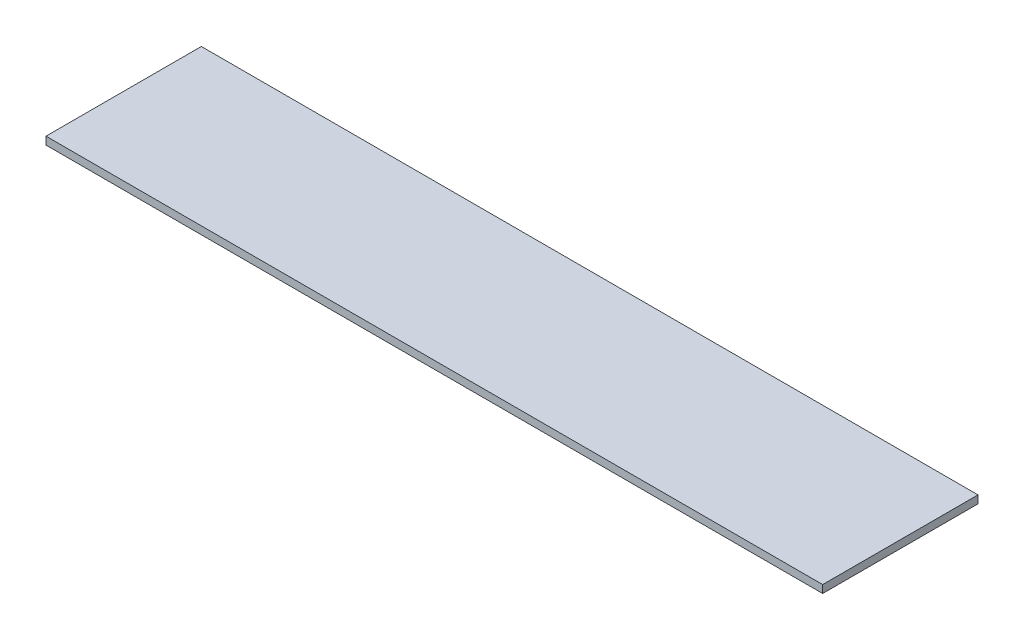
ISO-10303-21;
HEADER;
FILE_DESCRIPTION(('STEP AP214'),'2;1');
FILE_NAME('part.step','',(''),(''),'','','');
FILE_SCHEMA(('AUTOMOTIVE_DESIGN { 1 0 10303 214 1 1 1 1 }'));
ENDSEC;
DATA;
#1=APPLICATION_CONTEXT('core data for automotive mechanical design processes');
#2=APPLICATION_PROTOCOL_DEFINITION('international standard','automotive_design',2000,#1);
#3=PRODUCT_CONTEXT('',#1,'mechanical');
#4=PRODUCT('Part','Part','',(#3));
#5=PRODUCT_RELATED_PRODUCT_CATEGORY('part','',(#4));
#6=PRODUCT_DEFINITION_FORMATION('','',#4);
#7=PRODUCT_DEFINITION_CONTEXT('part definition',#1,'design');
#8=PRODUCT_DEFINITION('design','',#6,#7);
#9=PRODUCT_DEFINITION_SHAPE('','',#8);
#10=(LENGTH_UNIT() NAMED_UNIT(*) SI_UNIT(.MILLI.,.METRE.));
#11=(NAMED_UNIT(*) PLANE_ANGLE_UNIT() SI_UNIT($,.RADIAN.));
#12=(NAMED_UNIT(*) SI_UNIT($,.STERADIAN.) SOLID_ANGLE_UNIT());
#13=UNCERTAINTY_MEASURE_WITH_UNIT(LENGTH_MEASURE(1.E-05),#10,'distance_accuracy_value','');
#14=(GEOMETRIC_REPRESENTATION_CONTEXT(3) GLOBAL_UNCERTAINTY_ASSIGNED_CONTEXT((#13)) GLOBAL_UNIT_ASSIGNED_CONTEXT((#10,
#11,#12)) REPRESENTATION_CONTEXT('',''));
#15=CARTESIAN_POINT('',(0.,0.,0.));
#16=DIRECTION('',(0.,0.,1.));
#17=DIRECTION('',(1.,0.,0.));
#18=AXIS2_PLACEMENT_3D('',#15,#16,#17);
#19=CARTESIAN_POINT('',(-242.531208499336,50.8,-876.013280212483));
#20=DIRECTION('',(1.,0.,0.));
#21=DIRECTION('',(0.,0.,-1.));
#22=AXIS2_PLACEMENT_3D('',#19,#20,#21);
#23=PLANE('',#22);
#24=DIRECTION('',(0.,0.,1.));
#25=VECTOR('',#24,1.);
#26=CARTESIAN_POINT('',(-242.531208499336,0.,-876.013280212483));
#27=LINE('',#26,#25);
#28=CARTESIAN_POINT('',(-242.531208499336,0.,-876.013280212483));
#29=VERTEX_POINT('',#28);
#30=CARTESIAN_POINT('',(-242.531208499336,0.,139.986719787517));
#31=VERTEX_POINT('',#30);
#32=EDGE_CURVE('E96',#29,#31,#27,.T.);
#33=ORIENTED_EDGE('',*,*,#32,.T.);
#34=DIRECTION('',(0.,-1.,0.));
#35=VECTOR('',#34,1.);
#36=CARTESIAN_POINT('',(-242.531208499336,50.8,139.986719787517));
#37=LINE('',#36,#35);
#38=CARTESIAN_POINT('',(-242.531208499336,50.8,139.986719787517));
#39=VERTEX_POINT('',#38);
#40=EDGE_CURVE('E11',#39,#31,#37,.T.);
#41=ORIENTED_EDGE('',*,*,#40,.F.);
#42=DIRECTION('',(0.,0.,1.));
#43=VECTOR('',#42,1.);
#44=CARTESIAN_POINT('',(-242.531208499336,50.8,-876.013280212483));
#45=LINE('',#44,#43);
#46=CARTESIAN_POINT('',(-242.531208499336,50.8,-876.013280212483));
#47=VERTEX_POINT('',#46);
#48=EDGE_CURVE('E84',#47,#39,#45,.T.);
#49=ORIENTED_EDGE('',*,*,#48,.F.);
#50=DIRECTION('',(0.,-1.,0.));
#51=VECTOR('',#50,1.);
#52=CARTESIAN_POINT('',(-242.531208499336,50.8,-876.013280212483));
#53=LINE('',#52,#51);
#54=EDGE_CURVE('E92',#47,#29,#53,.T.);
#55=ORIENTED_EDGE('',*,*,#54,.T.);
#56=EDGE_LOOP('',(#33,#41,#49,#55));
#57=FACE_BOUND('',#56,.T.);
#58=ADVANCED_FACE('F33',(#57),#23,.F.);
#59=CARTESIAN_POINT('',(-242.531208499336,50.8,139.986719787517));
#60=DIRECTION('',(0.,0.,-1.));
#61=DIRECTION('',(-1.,0.,0.));
#62=AXIS2_PLACEMENT_3D('',#59,#60,#61);
#63=PLANE('',#62);
#64=DIRECTION('',(1.,0.,0.));
#65=VECTOR('',#64,1.);
#66=CARTESIAN_POINT('',(-242.531208499336,0.,139.986719787517));
#67=LINE('',#66,#65);
#68=CARTESIAN_POINT('',(4837.46879150066,0.,139.986719787517));
#69=VERTEX_POINT('',#68);
#70=EDGE_CURVE('E88',#31,#69,#67,.T.);
#71=ORIENTED_EDGE('',*,*,#70,.T.);
#72=DIRECTION('',(0.,-1.,0.));
#73=VECTOR('',#72,1.);
#74=CARTESIAN_POINT('',(4837.46879150066,50.8,139.986719787517));
#75=LINE('',#74,#73);
#76=CARTESIAN_POINT('',(4837.46879150066,50.8,139.986719787517));
#77=VERTEX_POINT('',#76);
#78=EDGE_CURVE('E41',#77,#69,#75,.T.);
#79=ORIENTED_EDGE('',*,*,#78,.F.);
#80=DIRECTION('',(1.,0.,0.));
#81=VECTOR('',#80,1.);
#82=CARTESIAN_POINT('',(-242.531208499336,50.8,139.986719787517));
#83=LINE('',#82,#81);
#84=EDGE_CURVE('E79',#39,#77,#83,.T.);
#85=ORIENTED_EDGE('',*,*,#84,.F.);
#86=ORIENTED_EDGE('',*,*,#40,.T.);
#87=EDGE_LOOP('',(#71,#79,#85,#86));
#88=FACE_BOUND('',#87,.T.);
#89=ADVANCED_FACE('F87',(#88),#63,.F.);
#90=CARTESIAN_POINT('',(4837.46879150066,50.8,-876.013280212483));
#91=DIRECTION('',(-1.,0.,0.));
#92=DIRECTION('',(0.,0.,1.));
#93=AXIS2_PLACEMENT_3D('',#90,#91,#92);
#94=PLANE('',#93);
#95=DIRECTION('',(0.,0.,-1.));
#96=VECTOR('',#95,1.);
#97=CARTESIAN_POINT('',(4837.46879150066,0.,-876.013280212483));
#98=LINE('',#97,#96);
#99=CARTESIAN_POINT('',(4837.46879150066,0.,-876.013280212483));
#100=VERTEX_POINT('',#99);
#101=EDGE_CURVE('E66',#69,#100,#98,.T.);
#102=ORIENTED_EDGE('',*,*,#101,.T.);
#103=DIRECTION('',(0.,-1.,0.));
#104=VECTOR('',#103,1.);
#105=CARTESIAN_POINT('',(4837.46879150066,50.8,-876.013280212483));
#106=LINE('',#105,#104);
#107=CARTESIAN_POINT('',(4837.46879150066,50.8,-876.013280212483));
#108=VERTEX_POINT('',#107);
#109=EDGE_CURVE('E89',#108,#100,#106,.T.);
#110=ORIENTED_EDGE('',*,*,#109,.F.);
#111=DIRECTION('',(0.,0.,-1.));
#112=VECTOR('',#111,1.);
#113=CARTESIAN_POINT('',(4837.46879150066,50.8,-876.013280212483));
#114=LINE('',#113,#112);
#115=EDGE_CURVE('E82',#77,#108,#114,.T.);
#116=ORIENTED_EDGE('',*,*,#115,.F.);
#117=ORIENTED_EDGE('',*,*,#78,.T.);
#118=EDGE_LOOP('',(#102,#110,#116,#117));
#119=FACE_BOUND('',#118,.T.);
#120=ADVANCED_FACE('F90',(#119),#94,.F.);
#121=CARTESIAN_POINT('',(-242.531208499336,50.8,-876.013280212483));
#122=DIRECTION('',(0.,0.,1.));
#123=DIRECTION('',(1.,0.,0.));
#124=AXIS2_PLACEMENT_3D('',#121,#122,#123);
#125=PLANE('',#124);
#126=DIRECTION('',(-1.,0.,0.));
#127=VECTOR('',#126,1.);
#128=CARTESIAN_POINT('',(-242.531208499336,0.,-876.013280212483));
#129=LINE('',#128,#127);
#130=EDGE_CURVE('E72',#100,#29,#129,.T.);
#131=ORIENTED_EDGE('',*,*,#130,.T.);
#132=ORIENTED_EDGE('',*,*,#54,.F.);
#133=DIRECTION('',(-1.,0.,0.));
#134=VECTOR('',#133,1.);
#135=CARTESIAN_POINT('',(-242.531208499336,50.8,-876.013280212483));
#136=LINE('',#135,#134);
#137=EDGE_CURVE('E49',#108,#47,#136,.T.);
#138=ORIENTED_EDGE('',*,*,#137,.F.);
#139=ORIENTED_EDGE('',*,*,#109,.T.);
#140=EDGE_LOOP('',(#131,#132,#138,#139));
#141=FACE_BOUND('',#140,.T.);
#142=ADVANCED_FACE('F103',(#141),#125,.F.);
#143=CARTESIAN_POINT('',(0.,50.8,0.));
#144=DIRECTION('',(0.,1.,0.));
#145=DIRECTION('',(0.,0.,1.));
#146=AXIS2_PLACEMENT_3D('',#143,#144,#145);
#147=PLANE('',#146);
#148=ORIENTED_EDGE('',*,*,#48,.T.);
#149=ORIENTED_EDGE('',*,*,#84,.T.);
#150=ORIENTED_EDGE('',*,*,#115,.T.);
#151=ORIENTED_EDGE('',*,*,#137,.T.);
#152=EDGE_LOOP('',(#148,#149,#150,#151));
#153=FACE_BOUND('',#152,.T.);
#154=ADVANCED_FACE('F80',(#153),#147,.T.);
#155=CARTESIAN_POINT('',(0.,0.,0.));
#156=DIRECTION('',(0.,1.,0.));
#157=DIRECTION('',(0.,0.,1.));
#158=AXIS2_PLACEMENT_3D('',#155,#156,#157);
#159=PLANE('',#158);
#160=ORIENTED_EDGE('',*,*,#32,.F.);
#161=ORIENTED_EDGE('',*,*,#130,.F.);
#162=ORIENTED_EDGE('',*,*,#101,.F.);
#163=ORIENTED_EDGE('',*,*,#70,.F.);
#164=EDGE_LOOP('',(#160,#161,#162,#163));
#165=FACE_BOUND('',#164,.T.);
#166=ADVANCED_FACE('F106',(#165),#159,.F.);
#167=CLOSED_SHELL('',(#58,#89,#120,#142,#154,#166));
#168=MANIFOLD_SOLID_BREP('B2',#167);
#169=ADVANCED_BREP_SHAPE_REPRESENTATION('',(#18,#168),#14);
#170=SHAPE_DEFINITION_REPRESENTATION(#9,#169);
ENDSEC;
END-ISO-10303-21;
